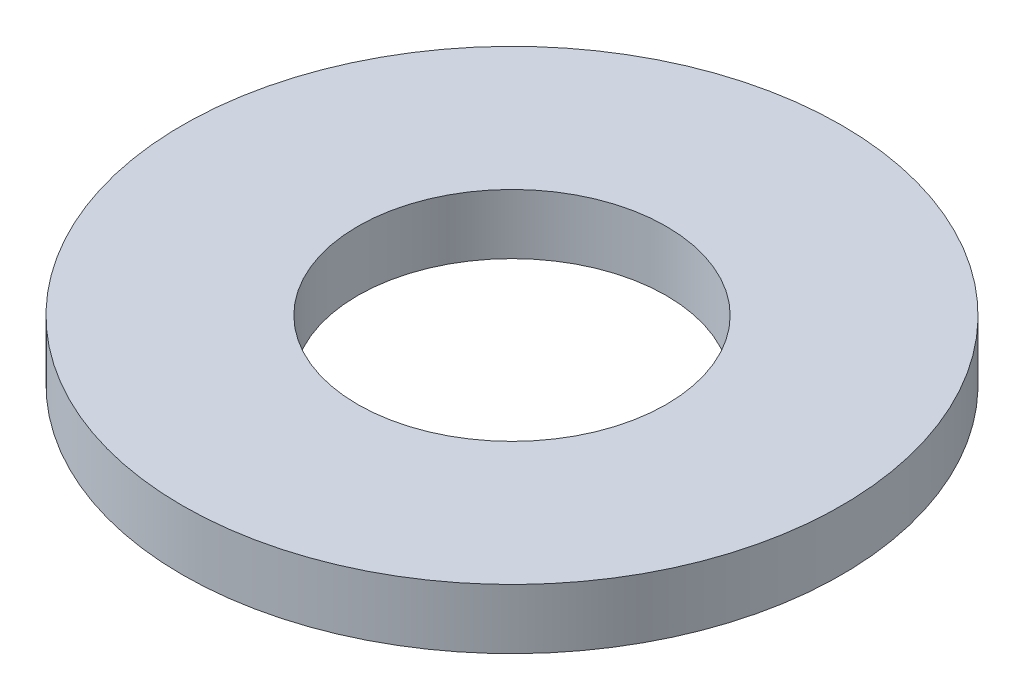
ISO-10303-21;
HEADER;
FILE_DESCRIPTION(('STEP AP214'),'2;1');
FILE_NAME('part.step','',(''),(''),'','','');
FILE_SCHEMA(('AUTOMOTIVE_DESIGN { 1 0 10303 214 1 1 1 1 }'));
ENDSEC;
DATA;
#1=APPLICATION_CONTEXT('core data for automotive mechanical design processes');
#2=APPLICATION_PROTOCOL_DEFINITION('international standard','automotive_design',2000,#1);
#3=PRODUCT_CONTEXT('',#1,'mechanical');
#4=PRODUCT('Part','Part','',(#3));
#5=PRODUCT_RELATED_PRODUCT_CATEGORY('part','',(#4));
#6=PRODUCT_DEFINITION_FORMATION('','',#4);
#7=PRODUCT_DEFINITION_CONTEXT('part definition',#1,'design');
#8=PRODUCT_DEFINITION('design','',#6,#7);
#9=PRODUCT_DEFINITION_SHAPE('','',#8);
#10=(LENGTH_UNIT() NAMED_UNIT(*) SI_UNIT(.MILLI.,.METRE.));
#11=(NAMED_UNIT(*) PLANE_ANGLE_UNIT() SI_UNIT($,.RADIAN.));
#12=(NAMED_UNIT(*) SI_UNIT($,.STERADIAN.) SOLID_ANGLE_UNIT());
#13=UNCERTAINTY_MEASURE_WITH_UNIT(LENGTH_MEASURE(1.E-05),#10,'distance_accuracy_value','');
#14=(GEOMETRIC_REPRESENTATION_CONTEXT(3) GLOBAL_UNCERTAINTY_ASSIGNED_CONTEXT((#13)) GLOBAL_UNIT_ASSIGNED_CONTEXT((#10,
#11,#12)) REPRESENTATION_CONTEXT('',''));
#15=CARTESIAN_POINT('',(0.,0.,0.));
#16=DIRECTION('',(0.,0.,1.));
#17=DIRECTION('',(1.,0.,0.));
#18=AXIS2_PLACEMENT_3D('',#15,#16,#17);
#19=CARTESIAN_POINT('',(0.,2.,0.));
#20=DIRECTION('',(0.,1.,0.));
#21=DIRECTION('',(0.,0.,1.));
#22=AXIS2_PLACEMENT_3D('',#19,#20,#21);
#23=PLANE('',#22);
#24=CARTESIAN_POINT('',(0.,2.,0.));
#25=DIRECTION('',(0.,1.,0.));
#26=DIRECTION('',(0.,0.,1.));
#27=AXIS2_PLACEMENT_3D('',#24,#25,#26);
#28=CIRCLE('',#27,11.);
#29=CARTESIAN_POINT('',(0.,2.,11.));
#30=VERTEX_POINT('',#29);
#31=EDGE_CURVE('E10',#30,#30,#28,.T.);
#32=ORIENTED_EDGE('',*,*,#31,.T.);
#33=EDGE_LOOP('',(#32));
#34=FACE_BOUND('',#33,.T.);
#35=CARTESIAN_POINT('',(0.,2.,0.));
#36=DIRECTION('',(0.,1.,0.));
#37=DIRECTION('',(0.,0.,1.));
#38=AXIS2_PLACEMENT_3D('',#35,#36,#37);
#39=CIRCLE('',#38,5.15);
#40=CARTESIAN_POINT('',(0.,2.,5.15));
#41=VERTEX_POINT('',#40);
#42=EDGE_CURVE('E51',#41,#41,#39,.T.);
#43=ORIENTED_EDGE('',*,*,#42,.F.);
#44=EDGE_LOOP('',(#43));
#45=FACE_BOUND('',#44,.T.);
#46=ADVANCED_FACE('F40',(#34,#45),#23,.T.);
#47=CARTESIAN_POINT('',(0.,0.,0.));
#48=DIRECTION('',(0.,1.,0.));
#49=DIRECTION('',(0.,0.,1.));
#50=AXIS2_PLACEMENT_3D('',#47,#48,#49);
#51=PLANE('',#50);
#52=CARTESIAN_POINT('',(0.,0.,0.));
#53=DIRECTION('',(0.,1.,0.));
#54=DIRECTION('',(0.,0.,1.));
#55=AXIS2_PLACEMENT_3D('',#52,#53,#54);
#56=CIRCLE('',#55,11.);
#57=CARTESIAN_POINT('',(0.,0.,11.));
#58=VERTEX_POINT('',#57);
#59=EDGE_CURVE('E44',#58,#58,#56,.T.);
#60=ORIENTED_EDGE('',*,*,#59,.F.);
#61=EDGE_LOOP('',(#60));
#62=FACE_BOUND('',#61,.T.);
#63=CARTESIAN_POINT('',(0.,0.,0.));
#64=DIRECTION('',(0.,1.,0.));
#65=DIRECTION('',(0.,0.,1.));
#66=AXIS2_PLACEMENT_3D('',#63,#64,#65);
#67=CIRCLE('',#66,5.15);
#68=CARTESIAN_POINT('',(0.,0.,5.15));
#69=VERTEX_POINT('',#68);
#70=EDGE_CURVE('E53',#69,#69,#67,.T.);
#71=ORIENTED_EDGE('',*,*,#70,.T.);
#72=EDGE_LOOP('',(#71));
#73=FACE_BOUND('',#72,.T.);
#74=ADVANCED_FACE('F63',(#62,#73),#51,.F.);
#75=CARTESIAN_POINT('',(0.,2.,0.));
#76=DIRECTION('',(0.,-1.,0.));
#77=DIRECTION('',(0.,0.,-1.));
#78=AXIS2_PLACEMENT_3D('',#75,#76,#77);
#79=CYLINDRICAL_SURFACE('',#78,11.);
#80=ORIENTED_EDGE('',*,*,#31,.F.);
#81=EDGE_LOOP('',(#80));
#82=FACE_BOUND('',#81,.T.);
#83=ORIENTED_EDGE('',*,*,#59,.T.);
#84=EDGE_LOOP('',(#83));
#85=FACE_BOUND('',#84,.T.);
#86=ADVANCED_FACE('F42',(#82,#85),#79,.T.);
#87=CARTESIAN_POINT('',(0.,2.,0.));
#88=DIRECTION('',(0.,-1.,0.));
#89=DIRECTION('',(0.,0.,-1.));
#90=AXIS2_PLACEMENT_3D('',#87,#88,#89);
#91=CYLINDRICAL_SURFACE('',#90,5.15);
#92=ORIENTED_EDGE('',*,*,#42,.T.);
#93=EDGE_LOOP('',(#92));
#94=FACE_BOUND('',#93,.T.);
#95=ORIENTED_EDGE('',*,*,#70,.F.);
#96=EDGE_LOOP('',(#95));
#97=FACE_BOUND('',#96,.T.);
#98=ADVANCED_FACE('F59',(#94,#97),#91,.F.);
#99=CLOSED_SHELL('',(#46,#74,#86,#98));
#100=MANIFOLD_SOLID_BREP('B2',#99);
#101=ADVANCED_BREP_SHAPE_REPRESENTATION('',(#18,#100),#14);
#102=SHAPE_DEFINITION_REPRESENTATION(#9,#101);
ENDSEC;
END-ISO-10303-21;
